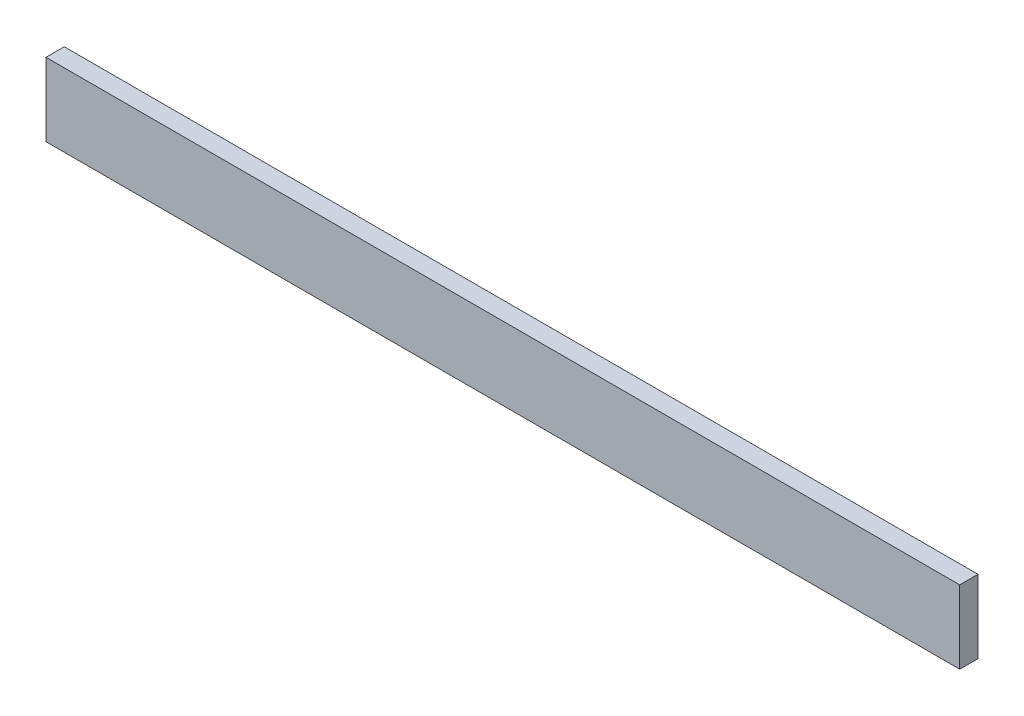
ISO-10303-21;
HEADER;
FILE_DESCRIPTION(('STEP AP214'),'2;1');
FILE_NAME('part.step','',(''),(''),'','','');
FILE_SCHEMA(('AUTOMOTIVE_DESIGN { 1 0 10303 214 1 1 1 1 }'));
ENDSEC;
DATA;
#1=APPLICATION_CONTEXT('core data for automotive mechanical design processes');
#2=APPLICATION_PROTOCOL_DEFINITION('international standard','automotive_design',2000,#1);
#3=PRODUCT_CONTEXT('',#1,'mechanical');
#4=PRODUCT('Part','Part','',(#3));
#5=PRODUCT_RELATED_PRODUCT_CATEGORY('part','',(#4));
#6=PRODUCT_DEFINITION_FORMATION('','',#4);
#7=PRODUCT_DEFINITION_CONTEXT('part definition',#1,'design');
#8=PRODUCT_DEFINITION('design','',#6,#7);
#9=PRODUCT_DEFINITION_SHAPE('','',#8);
#10=(LENGTH_UNIT() NAMED_UNIT(*) SI_UNIT(.MILLI.,.METRE.));
#11=(NAMED_UNIT(*) PLANE_ANGLE_UNIT() SI_UNIT($,.RADIAN.));
#12=(NAMED_UNIT(*) SI_UNIT($,.STERADIAN.) SOLID_ANGLE_UNIT());
#13=UNCERTAINTY_MEASURE_WITH_UNIT(LENGTH_MEASURE(1.E-05),#10,'distance_accuracy_value','');
#14=(GEOMETRIC_REPRESENTATION_CONTEXT(3) GLOBAL_UNCERTAINTY_ASSIGNED_CONTEXT((#13)) GLOBAL_UNIT_ASSIGNED_CONTEXT((#10,
#11,#12)) REPRESENTATION_CONTEXT('',''));
#15=CARTESIAN_POINT('',(0.,0.,0.));
#16=DIRECTION('',(0.,0.,1.));
#17=DIRECTION('',(1.,0.,0.));
#18=AXIS2_PLACEMENT_3D('',#15,#16,#17);
#19=CARTESIAN_POINT('',(0.,20.,5.));
#20=DIRECTION('',(1.,0.,0.));
#21=DIRECTION('',(0.,1.,0.));
#22=AXIS2_PLACEMENT_3D('',#19,#20,#21);
#23=PLANE('',#22);
#24=DIRECTION('',(0.,-1.,0.));
#25=VECTOR('',#24,1.);
#26=CARTESIAN_POINT('',(0.,20.,0.));
#27=LINE('',#26,#25);
#28=CARTESIAN_POINT('',(0.,20.,0.));
#29=VERTEX_POINT('',#28);
#30=CARTESIAN_POINT('',(0.,0.,0.));
#31=VERTEX_POINT('',#30);
#32=EDGE_CURVE('E107',#29,#31,#27,.T.);
#33=ORIENTED_EDGE('',*,*,#32,.T.);
#34=DIRECTION('',(0.,0.,-1.));
#35=VECTOR('',#34,1.);
#36=CARTESIAN_POINT('',(0.,0.,5.));
#37=LINE('',#36,#35);
#38=CARTESIAN_POINT('',(0.,0.,5.));
#39=VERTEX_POINT('',#38);
#40=EDGE_CURVE('E11',#39,#31,#37,.T.);
#41=ORIENTED_EDGE('',*,*,#40,.F.);
#42=DIRECTION('',(0.,-1.,0.));
#43=VECTOR('',#42,1.);
#44=CARTESIAN_POINT('',(0.,20.,5.));
#45=LINE('',#44,#43);
#46=CARTESIAN_POINT('',(0.,20.,5.));
#47=VERTEX_POINT('',#46);
#48=EDGE_CURVE('E91',#47,#39,#45,.T.);
#49=ORIENTED_EDGE('',*,*,#48,.F.);
#50=DIRECTION('',(0.,0.,-1.));
#51=VECTOR('',#50,1.);
#52=CARTESIAN_POINT('',(0.,20.,5.));
#53=LINE('',#52,#51);
#54=EDGE_CURVE('E103',#47,#29,#53,.T.);
#55=ORIENTED_EDGE('',*,*,#54,.T.);
#56=EDGE_LOOP('',(#33,#41,#49,#55));
#57=FACE_BOUND('',#56,.T.);
#58=ADVANCED_FACE('F39',(#57),#23,.F.);
#59=CARTESIAN_POINT('',(0.,0.,5.));
#60=DIRECTION('',(0.,1.,0.));
#61=DIRECTION('',(0.,0.,1.));
#62=AXIS2_PLACEMENT_3D('',#59,#60,#61);
#63=PLANE('',#62);
#64=DIRECTION('',(1.,0.,0.));
#65=VECTOR('',#64,1.);
#66=CARTESIAN_POINT('',(0.,0.,0.));
#67=LINE('',#66,#65);
#68=CARTESIAN_POINT('',(250.,0.,0.));
#69=VERTEX_POINT('',#68);
#70=EDGE_CURVE('E96',#31,#69,#67,.T.);
#71=ORIENTED_EDGE('',*,*,#70,.T.);
#72=DIRECTION('',(0.,0.,-1.));
#73=VECTOR('',#72,1.);
#74=CARTESIAN_POINT('',(250.,0.,5.));
#75=LINE('',#74,#73);
#76=CARTESIAN_POINT('',(250.,0.,5.));
#77=VERTEX_POINT('',#76);
#78=EDGE_CURVE('E48',#77,#69,#75,.T.);
#79=ORIENTED_EDGE('',*,*,#78,.F.);
#80=DIRECTION('',(1.,0.,0.));
#81=VECTOR('',#80,1.);
#82=CARTESIAN_POINT('',(0.,0.,5.));
#83=LINE('',#82,#81);
#84=EDGE_CURVE('E86',#39,#77,#83,.T.);
#85=ORIENTED_EDGE('',*,*,#84,.F.);
#86=ORIENTED_EDGE('',*,*,#40,.T.);
#87=EDGE_LOOP('',(#71,#79,#85,#86));
#88=FACE_BOUND('',#87,.T.);
#89=ADVANCED_FACE('F95',(#88),#63,.F.);
#90=CARTESIAN_POINT('',(250.,0.,5.));
#91=DIRECTION('',(-1.,0.,0.));
#92=DIRECTION('',(0.,0.,1.));
#93=AXIS2_PLACEMENT_3D('',#90,#91,#92);
#94=PLANE('',#93);
#95=DIRECTION('',(0.,1.,0.));
#96=VECTOR('',#95,1.);
#97=CARTESIAN_POINT('',(250.,0.,0.));
#98=LINE('',#97,#96);
#99=CARTESIAN_POINT('',(250.,20.,0.));
#100=VERTEX_POINT('',#99);
#101=EDGE_CURVE('E73',#69,#100,#98,.T.);
#102=ORIENTED_EDGE('',*,*,#101,.T.);
#103=DIRECTION('',(0.,0.,-1.));
#104=VECTOR('',#103,1.);
#105=CARTESIAN_POINT('',(250.,20.,5.));
#106=LINE('',#105,#104);
#107=CARTESIAN_POINT('',(250.,20.,5.));
#108=VERTEX_POINT('',#107);
#109=EDGE_CURVE('E98',#108,#100,#106,.T.);
#110=ORIENTED_EDGE('',*,*,#109,.F.);
#111=DIRECTION('',(0.,1.,0.));
#112=VECTOR('',#111,1.);
#113=CARTESIAN_POINT('',(250.,0.,5.));
#114=LINE('',#113,#112);
#115=EDGE_CURVE('E89',#77,#108,#114,.T.);
#116=ORIENTED_EDGE('',*,*,#115,.F.);
#117=ORIENTED_EDGE('',*,*,#78,.T.);
#118=EDGE_LOOP('',(#102,#110,#116,#117));
#119=FACE_BOUND('',#118,.T.);
#120=ADVANCED_FACE('F99',(#119),#94,.F.);
#121=CARTESIAN_POINT('',(250.,20.,5.));
#122=DIRECTION('',(0.,-1.,0.));
#123=DIRECTION('',(1.,0.,0.));
#124=AXIS2_PLACEMENT_3D('',#121,#122,#123);
#125=PLANE('',#124);
#126=DIRECTION('',(-1.,0.,0.));
#127=VECTOR('',#126,1.);
#128=CARTESIAN_POINT('',(250.,20.,0.));
#129=LINE('',#128,#127);
#130=EDGE_CURVE('E79',#100,#29,#129,.T.);
#131=ORIENTED_EDGE('',*,*,#130,.T.);
#132=ORIENTED_EDGE('',*,*,#54,.F.);
#133=DIRECTION('',(-1.,0.,0.));
#134=VECTOR('',#133,1.);
#135=CARTESIAN_POINT('',(250.,20.,5.));
#136=LINE('',#135,#134);
#137=EDGE_CURVE('E56',#108,#47,#136,.T.);
#138=ORIENTED_EDGE('',*,*,#137,.F.);
#139=ORIENTED_EDGE('',*,*,#109,.T.);
#140=EDGE_LOOP('',(#131,#132,#138,#139));
#141=FACE_BOUND('',#140,.T.);
#142=ADVANCED_FACE('F120',(#141),#125,.F.);
#143=CARTESIAN_POINT('',(0.,0.,5.));
#144=DIRECTION('',(0.,0.,1.));
#145=DIRECTION('',(1.,0.,0.));
#146=AXIS2_PLACEMENT_3D('',#143,#144,#145);
#147=PLANE('',#146);
#148=ORIENTED_EDGE('',*,*,#48,.T.);
#149=ORIENTED_EDGE('',*,*,#84,.T.);
#150=ORIENTED_EDGE('',*,*,#115,.T.);
#151=ORIENTED_EDGE('',*,*,#137,.T.);
#152=EDGE_LOOP('',(#148,#149,#150,#151));
#153=FACE_BOUND('',#152,.T.);
#154=ADVANCED_FACE('F87',(#153),#147,.T.);
#155=CARTESIAN_POINT('',(0.,0.,0.));
#156=DIRECTION('',(0.,0.,1.));
#157=DIRECTION('',(1.,0.,0.));
#158=AXIS2_PLACEMENT_3D('',#155,#156,#157);
#159=PLANE('',#158);
#160=ORIENTED_EDGE('',*,*,#32,.F.);
#161=ORIENTED_EDGE('',*,*,#130,.F.);
#162=ORIENTED_EDGE('',*,*,#101,.F.);
#163=ORIENTED_EDGE('',*,*,#70,.F.);
#164=EDGE_LOOP('',(#160,#161,#162,#163));
#165=FACE_BOUND('',#164,.T.);
#166=ADVANCED_FACE('F123',(#165),#159,.F.);
#167=CLOSED_SHELL('',(#58,#89,#120,#142,#154,#166));
#168=MANIFOLD_SOLID_BREP('B2',#167);
#169=ADVANCED_BREP_SHAPE_REPRESENTATION('',(#18,#168),#14);
#170=SHAPE_DEFINITION_REPRESENTATION(#9,#169);
ENDSEC;
END-ISO-10303-21;
